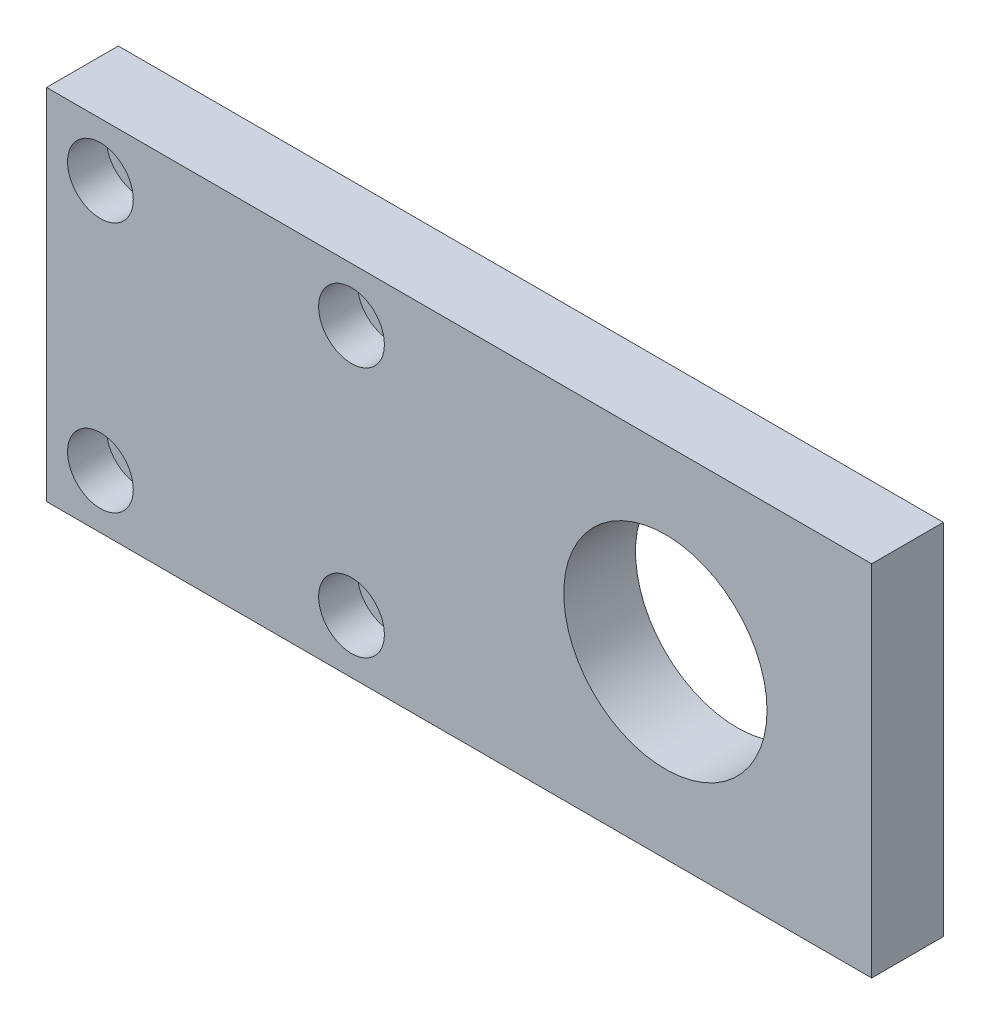
ISO-10303-21;
HEADER;
FILE_DESCRIPTION(('STEP AP214'),'2;1');
FILE_NAME('part.step','',(''),(''),'','','');
FILE_SCHEMA(('AUTOMOTIVE_DESIGN { 1 0 10303 214 1 1 1 1 }'));
ENDSEC;
DATA;
#1=APPLICATION_CONTEXT('core data for automotive mechanical design processes');
#2=APPLICATION_PROTOCOL_DEFINITION('international standard','automotive_design',2000,#1);
#3=PRODUCT_CONTEXT('',#1,'mechanical');
#4=PRODUCT('Part','Part','',(#3));
#5=PRODUCT_RELATED_PRODUCT_CATEGORY('part','',(#4));
#6=PRODUCT_DEFINITION_FORMATION('','',#4);
#7=PRODUCT_DEFINITION_CONTEXT('part definition',#1,'design');
#8=PRODUCT_DEFINITION('design','',#6,#7);
#9=PRODUCT_DEFINITION_SHAPE('','',#8);
#10=(LENGTH_UNIT() NAMED_UNIT(*) SI_UNIT(.MILLI.,.METRE.));
#11=(NAMED_UNIT(*) PLANE_ANGLE_UNIT() SI_UNIT($,.RADIAN.));
#12=(NAMED_UNIT(*) SI_UNIT($,.STERADIAN.) SOLID_ANGLE_UNIT());
#13=UNCERTAINTY_MEASURE_WITH_UNIT(LENGTH_MEASURE(1.E-05),#10,'distance_accuracy_value','');
#14=(GEOMETRIC_REPRESENTATION_CONTEXT(3) GLOBAL_UNCERTAINTY_ASSIGNED_CONTEXT((#13)) GLOBAL_UNIT_ASSIGNED_CONTEXT((#10,
#11,#12)) REPRESENTATION_CONTEXT('',''));
#15=CARTESIAN_POINT('',(0.,0.,0.));
#16=DIRECTION('',(0.,0.,1.));
#17=DIRECTION('',(1.,0.,0.));
#18=AXIS2_PLACEMENT_3D('',#15,#16,#17);
#19=CARTESIAN_POINT('',(0.,0.,12.));
#20=DIRECTION('',(0.,0.,1.));
#21=DIRECTION('',(1.,0.,0.));
#22=AXIS2_PLACEMENT_3D('',#19,#20,#21);
#23=PLANE('',#22);
#24=CARTESIAN_POINT('',(-61.,351.,12.));
#25=DIRECTION('',(0.,0.,1.));
#26=DIRECTION('',(1.,0.,0.));
#27=AXIS2_PLACEMENT_3D('',#24,#25,#26);
#28=CIRCLE('',#27,5.5);
#29=CARTESIAN_POINT('',(-55.5,351.,12.));
#30=VERTEX_POINT('',#29);
#31=EDGE_CURVE('E162',#30,#30,#28,.T.);
#32=ORIENTED_EDGE('',*,*,#31,.F.);
#33=EDGE_LOOP('',(#32));
#34=FACE_BOUND('',#33,.T.);
#35=CARTESIAN_POINT('',(-19.,351.,12.));
#36=DIRECTION('',(0.,0.,1.));
#37=DIRECTION('',(1.,0.,0.));
#38=AXIS2_PLACEMENT_3D('',#35,#36,#37);
#39=CIRCLE('',#38,5.5);
#40=CARTESIAN_POINT('',(-13.5,351.,12.));
#41=VERTEX_POINT('',#40);
#42=EDGE_CURVE('E150',#41,#41,#39,.T.);
#43=ORIENTED_EDGE('',*,*,#42,.F.);
#44=EDGE_LOOP('',(#43));
#45=FACE_BOUND('',#44,.T.);
#46=CARTESIAN_POINT('',(-61.,309.,12.));
#47=DIRECTION('',(0.,0.,1.));
#48=DIRECTION('',(1.,0.,0.));
#49=AXIS2_PLACEMENT_3D('',#46,#47,#48);
#50=CIRCLE('',#49,5.5);
#51=CARTESIAN_POINT('',(-55.5,309.,12.));
#52=VERTEX_POINT('',#51);
#53=EDGE_CURVE('E138',#52,#52,#50,.T.);
#54=ORIENTED_EDGE('',*,*,#53,.F.);
#55=EDGE_LOOP('',(#54));
#56=FACE_BOUND('',#55,.T.);
#57=CARTESIAN_POINT('',(-19.,309.,12.));
#58=DIRECTION('',(0.,0.,1.));
#59=DIRECTION('',(1.,0.,0.));
#60=AXIS2_PLACEMENT_3D('',#57,#58,#59);
#61=CIRCLE('',#60,5.5);
#62=CARTESIAN_POINT('',(-13.5,309.,12.));
#63=VERTEX_POINT('',#62);
#64=EDGE_CURVE('E126',#63,#63,#61,.T.);
#65=ORIENTED_EDGE('',*,*,#64,.F.);
#66=EDGE_LOOP('',(#65));
#67=FACE_BOUND('',#66,.T.);
#68=DIRECTION('',(0.,-1.,0.));
#69=VECTOR('',#68,1.);
#70=CARTESIAN_POINT('',(-70.,360.,12.));
#71=LINE('',#70,#69);
#72=CARTESIAN_POINT('',(-70.,360.,12.));
#73=VERTEX_POINT('',#72);
#74=CARTESIAN_POINT('',(-70.,300.,12.));
#75=VERTEX_POINT('',#74);
#76=EDGE_CURVE('E85',#73,#75,#71,.T.);
#77=ORIENTED_EDGE('',*,*,#76,.T.);
#78=DIRECTION('',(1.,0.,0.));
#79=VECTOR('',#78,1.);
#80=CARTESIAN_POINT('',(-70.,300.,12.));
#81=LINE('',#80,#79);
#82=CARTESIAN_POINT('',(68.,300.,12.));
#83=VERTEX_POINT('',#82);
#84=EDGE_CURVE('E80',#75,#83,#81,.T.);
#85=ORIENTED_EDGE('',*,*,#84,.T.);
#86=DIRECTION('',(0.,1.,0.));
#87=VECTOR('',#86,1.);
#88=CARTESIAN_POINT('',(68.,360.,12.));
#89=LINE('',#88,#87);
#90=CARTESIAN_POINT('',(68.,360.,12.));
#91=VERTEX_POINT('',#90);
#92=EDGE_CURVE('E83',#83,#91,#89,.T.);
#93=ORIENTED_EDGE('',*,*,#92,.T.);
#94=DIRECTION('',(-1.,0.,0.));
#95=VECTOR('',#94,1.);
#96=CARTESIAN_POINT('',(-70.,360.,12.));
#97=LINE('',#96,#95);
#98=EDGE_CURVE('E50',#91,#73,#97,.T.);
#99=ORIENTED_EDGE('',*,*,#98,.T.);
#100=EDGE_LOOP('',(#77,#85,#93,#99));
#101=FACE_BOUND('',#100,.T.);
#102=CARTESIAN_POINT('',(33.5,330.,12.));
#103=DIRECTION('',(0.,0.,1.));
#104=DIRECTION('',(1.,0.,0.));
#105=AXIS2_PLACEMENT_3D('',#102,#103,#104);
#106=CIRCLE('',#105,17.);
#107=CARTESIAN_POINT('',(50.5,330.,12.));
#108=VERTEX_POINT('',#107);
#109=EDGE_CURVE('E100',#108,#108,#106,.T.);
#110=ORIENTED_EDGE('',*,*,#109,.F.);
#111=EDGE_LOOP('',(#110));
#112=FACE_BOUND('',#111,.T.);
#113=ADVANCED_FACE('F33',(#34,#45,#56,#67,#101,#112),#23,.T.);
#114=CARTESIAN_POINT('',(0.,0.,0.));
#115=DIRECTION('',(0.,0.,1.));
#116=DIRECTION('',(1.,0.,0.));
#117=AXIS2_PLACEMENT_3D('',#114,#115,#116);
#118=PLANE('',#117);
#119=CARTESIAN_POINT('',(-61.,351.,0.));
#120=DIRECTION('',(0.,0.,1.));
#121=DIRECTION('',(1.,0.,0.));
#122=AXIS2_PLACEMENT_3D('',#119,#120,#121);
#123=CIRCLE('',#122,2.75);
#124=CARTESIAN_POINT('',(-58.25,351.,0.));
#125=VERTEX_POINT('',#124);
#126=EDGE_CURVE('E153',#125,#125,#123,.T.);
#127=ORIENTED_EDGE('',*,*,#126,.T.);
#128=EDGE_LOOP('',(#127));
#129=FACE_BOUND('',#128,.T.);
#130=CARTESIAN_POINT('',(-19.,351.,0.));
#131=DIRECTION('',(0.,0.,1.));
#132=DIRECTION('',(1.,0.,0.));
#133=AXIS2_PLACEMENT_3D('',#130,#131,#132);
#134=CIRCLE('',#133,2.75);
#135=CARTESIAN_POINT('',(-16.25,351.,0.));
#136=VERTEX_POINT('',#135);
#137=EDGE_CURVE('E141',#136,#136,#134,.T.);
#138=ORIENTED_EDGE('',*,*,#137,.T.);
#139=EDGE_LOOP('',(#138));
#140=FACE_BOUND('',#139,.T.);
#141=CARTESIAN_POINT('',(-61.,309.,0.));
#142=DIRECTION('',(0.,0.,1.));
#143=DIRECTION('',(1.,0.,0.));
#144=AXIS2_PLACEMENT_3D('',#141,#142,#143);
#145=CIRCLE('',#144,2.75);
#146=CARTESIAN_POINT('',(-58.25,309.,0.));
#147=VERTEX_POINT('',#146);
#148=EDGE_CURVE('E129',#147,#147,#145,.T.);
#149=ORIENTED_EDGE('',*,*,#148,.T.);
#150=EDGE_LOOP('',(#149));
#151=FACE_BOUND('',#150,.T.);
#152=CARTESIAN_POINT('',(-19.,309.,0.));
#153=DIRECTION('',(0.,0.,1.));
#154=DIRECTION('',(1.,0.,0.));
#155=AXIS2_PLACEMENT_3D('',#152,#153,#154);
#156=CIRCLE('',#155,2.75);
#157=CARTESIAN_POINT('',(-16.25,309.,0.));
#158=VERTEX_POINT('',#157);
#159=EDGE_CURVE('E115',#158,#158,#156,.T.);
#160=ORIENTED_EDGE('',*,*,#159,.T.);
#161=EDGE_LOOP('',(#160));
#162=FACE_BOUND('',#161,.T.);
#163=DIRECTION('',(0.,-1.,0.));
#164=VECTOR('',#163,1.);
#165=CARTESIAN_POINT('',(-70.,360.,0.));
#166=LINE('',#165,#164);
#167=CARTESIAN_POINT('',(-70.,360.,0.));
#168=VERTEX_POINT('',#167);
#169=CARTESIAN_POINT('',(-70.,300.,0.));
#170=VERTEX_POINT('',#169);
#171=EDGE_CURVE('E97',#168,#170,#166,.T.);
#172=ORIENTED_EDGE('',*,*,#171,.F.);
#173=DIRECTION('',(-1.,0.,0.));
#174=VECTOR('',#173,1.);
#175=CARTESIAN_POINT('',(-70.,360.,0.));
#176=LINE('',#175,#174);
#177=CARTESIAN_POINT('',(68.,360.,0.));
#178=VERTEX_POINT('',#177);
#179=EDGE_CURVE('E73',#178,#168,#176,.T.);
#180=ORIENTED_EDGE('',*,*,#179,.F.);
#181=DIRECTION('',(0.,1.,0.));
#182=VECTOR('',#181,1.);
#183=CARTESIAN_POINT('',(68.,360.,0.));
#184=LINE('',#183,#182);
#185=CARTESIAN_POINT('',(68.,300.,0.));
#186=VERTEX_POINT('',#185);
#187=EDGE_CURVE('E67',#186,#178,#184,.T.);
#188=ORIENTED_EDGE('',*,*,#187,.F.);
#189=DIRECTION('',(1.,0.,0.));
#190=VECTOR('',#189,1.);
#191=CARTESIAN_POINT('',(-70.,300.,0.));
#192=LINE('',#191,#190);
#193=EDGE_CURVE('E89',#170,#186,#192,.T.);
#194=ORIENTED_EDGE('',*,*,#193,.F.);
#195=EDGE_LOOP('',(#172,#180,#188,#194));
#196=FACE_BOUND('',#195,.T.);
#197=CARTESIAN_POINT('',(33.5,330.,0.));
#198=DIRECTION('',(0.,0.,1.));
#199=DIRECTION('',(1.,0.,0.));
#200=AXIS2_PLACEMENT_3D('',#197,#198,#199);
#201=CIRCLE('',#200,17.);
#202=CARTESIAN_POINT('',(50.5,330.,0.));
#203=VERTEX_POINT('',#202);
#204=EDGE_CURVE('E112',#203,#203,#201,.T.);
#205=ORIENTED_EDGE('',*,*,#204,.T.);
#206=EDGE_LOOP('',(#205));
#207=FACE_BOUND('',#206,.T.);
#208=ADVANCED_FACE('F108',(#129,#140,#151,#162,#196,#207),#118,.F.);
#209=CARTESIAN_POINT('',(-70.,360.,12.));
#210=DIRECTION('',(1.,0.,0.));
#211=DIRECTION('',(0.,1.,0.));
#212=AXIS2_PLACEMENT_3D('',#209,#210,#211);
#213=PLANE('',#212);
#214=ORIENTED_EDGE('',*,*,#171,.T.);
#215=DIRECTION('',(0.,0.,-1.));
#216=VECTOR('',#215,1.);
#217=CARTESIAN_POINT('',(-70.,300.,12.));
#218=LINE('',#217,#216);
#219=EDGE_CURVE('E11',#75,#170,#218,.T.);
#220=ORIENTED_EDGE('',*,*,#219,.F.);
#221=ORIENTED_EDGE('',*,*,#76,.F.);
#222=DIRECTION('',(0.,0.,-1.));
#223=VECTOR('',#222,1.);
#224=CARTESIAN_POINT('',(-70.,360.,12.));
#225=LINE('',#224,#223);
#226=EDGE_CURVE('E93',#73,#168,#225,.T.);
#227=ORIENTED_EDGE('',*,*,#226,.T.);
#228=EDGE_LOOP('',(#214,#220,#221,#227));
#229=FACE_BOUND('',#228,.T.);
#230=ADVANCED_FACE('F35',(#229),#213,.F.);
#231=CARTESIAN_POINT('',(-70.,300.,12.));
#232=DIRECTION('',(0.,1.,0.));
#233=DIRECTION('',(0.,0.,1.));
#234=AXIS2_PLACEMENT_3D('',#231,#232,#233);
#235=PLANE('',#234);
#236=ORIENTED_EDGE('',*,*,#193,.T.);
#237=DIRECTION('',(0.,0.,-1.));
#238=VECTOR('',#237,1.);
#239=CARTESIAN_POINT('',(68.,300.,12.));
#240=LINE('',#239,#238);
#241=EDGE_CURVE('E42',#83,#186,#240,.T.);
#242=ORIENTED_EDGE('',*,*,#241,.F.);
#243=ORIENTED_EDGE('',*,*,#84,.F.);
#244=ORIENTED_EDGE('',*,*,#219,.T.);
#245=EDGE_LOOP('',(#236,#242,#243,#244));
#246=FACE_BOUND('',#245,.T.);
#247=ADVANCED_FACE('F88',(#246),#235,.F.);
#248=CARTESIAN_POINT('',(68.,360.,12.));
#249=DIRECTION('',(-1.,0.,0.));
#250=DIRECTION('',(0.,-1.,0.));
#251=AXIS2_PLACEMENT_3D('',#248,#249,#250);
#252=PLANE('',#251);
#253=ORIENTED_EDGE('',*,*,#187,.T.);
#254=DIRECTION('',(0.,0.,-1.));
#255=VECTOR('',#254,1.);
#256=CARTESIAN_POINT('',(68.,360.,12.));
#257=LINE('',#256,#255);
#258=EDGE_CURVE('E90',#91,#178,#257,.T.);
#259=ORIENTED_EDGE('',*,*,#258,.F.);
#260=ORIENTED_EDGE('',*,*,#92,.F.);
#261=ORIENTED_EDGE('',*,*,#241,.T.);
#262=EDGE_LOOP('',(#253,#259,#260,#261));
#263=FACE_BOUND('',#262,.T.);
#264=ADVANCED_FACE('F91',(#263),#252,.F.);
#265=CARTESIAN_POINT('',(-70.,360.,12.));
#266=DIRECTION('',(0.,-1.,0.));
#267=DIRECTION('',(0.,0.,-1.));
#268=AXIS2_PLACEMENT_3D('',#265,#266,#267);
#269=PLANE('',#268);
#270=ORIENTED_EDGE('',*,*,#179,.T.);
#271=ORIENTED_EDGE('',*,*,#226,.F.);
#272=ORIENTED_EDGE('',*,*,#98,.F.);
#273=ORIENTED_EDGE('',*,*,#258,.T.);
#274=EDGE_LOOP('',(#270,#271,#272,#273));
#275=FACE_BOUND('',#274,.T.);
#276=ADVANCED_FACE('F105',(#275),#269,.F.);
#277=CARTESIAN_POINT('',(33.5,330.,12.));
#278=DIRECTION('',(0.,0.,-1.));
#279=DIRECTION('',(-1.,0.,0.));
#280=AXIS2_PLACEMENT_3D('',#277,#278,#279);
#281=CYLINDRICAL_SURFACE('',#280,17.);
#282=ORIENTED_EDGE('',*,*,#109,.T.);
#283=EDGE_LOOP('',(#282));
#284=FACE_BOUND('',#283,.T.);
#285=ORIENTED_EDGE('',*,*,#204,.F.);
#286=EDGE_LOOP('',(#285));
#287=FACE_BOUND('',#286,.T.);
#288=ADVANCED_FACE('F198',(#284,#287),#281,.F.);
#289=CARTESIAN_POINT('',(-19.,309.,12.));
#290=DIRECTION('',(0.,0.,1.));
#291=DIRECTION('',(1.,0.,0.));
#292=AXIS2_PLACEMENT_3D('',#289,#290,#291);
#293=CYLINDRICAL_SURFACE('',#292,2.75);
#294=ORIENTED_EDGE('',*,*,#159,.F.);
#295=EDGE_LOOP('',(#294));
#296=FACE_BOUND('',#295,.T.);
#297=CARTESIAN_POINT('',(-19.,309.,5.5));
#298=DIRECTION('',(0.,0.,1.));
#299=DIRECTION('',(1.,0.,0.));
#300=AXIS2_PLACEMENT_3D('',#297,#298,#299);
#301=CIRCLE('',#300,2.75);
#302=CARTESIAN_POINT('',(-16.25,309.,5.5));
#303=VERTEX_POINT('',#302);
#304=EDGE_CURVE('E120',#303,#303,#301,.T.);
#305=ORIENTED_EDGE('',*,*,#304,.T.);
#306=EDGE_LOOP('',(#305));
#307=FACE_BOUND('',#306,.T.);
#308=ADVANCED_FACE('F190',(#296,#307),#293,.F.);
#309=CARTESIAN_POINT('',(-16.25,309.,5.5));
#310=DIRECTION('',(0.,0.,-1.));
#311=DIRECTION('',(-1.,0.,0.));
#312=AXIS2_PLACEMENT_3D('',#309,#310,#311);
#313=PLANE('',#312);
#314=ORIENTED_EDGE('',*,*,#304,.F.);
#315=EDGE_LOOP('',(#314));
#316=FACE_BOUND('',#315,.T.);
#317=CARTESIAN_POINT('',(-19.,309.,5.5));
#318=DIRECTION('',(0.,0.,1.));
#319=DIRECTION('',(1.,0.,0.));
#320=AXIS2_PLACEMENT_3D('',#317,#318,#319);
#321=CIRCLE('',#320,5.5);
#322=CARTESIAN_POINT('',(-13.5,309.,5.5));
#323=VERTEX_POINT('',#322);
#324=EDGE_CURVE('E123',#323,#323,#321,.T.);
#325=ORIENTED_EDGE('',*,*,#324,.T.);
#326=EDGE_LOOP('',(#325));
#327=FACE_BOUND('',#326,.T.);
#328=ADVANCED_FACE('F180',(#316,#327),#313,.F.);
#329=CARTESIAN_POINT('',(-19.,309.,12.));
#330=DIRECTION('',(0.,0.,1.));
#331=DIRECTION('',(1.,0.,0.));
#332=AXIS2_PLACEMENT_3D('',#329,#330,#331);
#333=CYLINDRICAL_SURFACE('',#332,5.5);
#334=ORIENTED_EDGE('',*,*,#324,.F.);
#335=EDGE_LOOP('',(#334));
#336=FACE_BOUND('',#335,.T.);
#337=ORIENTED_EDGE('',*,*,#64,.T.);
#338=EDGE_LOOP('',(#337));
#339=FACE_BOUND('',#338,.T.);
#340=ADVANCED_FACE('F177',(#336,#339),#333,.F.);
#341=CARTESIAN_POINT('',(-61.,309.,12.));
#342=DIRECTION('',(0.,0.,1.));
#343=DIRECTION('',(1.,0.,0.));
#344=AXIS2_PLACEMENT_3D('',#341,#342,#343);
#345=CYLINDRICAL_SURFACE('',#344,2.75);
#346=ORIENTED_EDGE('',*,*,#148,.F.);
#347=EDGE_LOOP('',(#346));
#348=FACE_BOUND('',#347,.T.);
#349=CARTESIAN_POINT('',(-61.,309.,5.5));
#350=DIRECTION('',(0.,0.,1.));
#351=DIRECTION('',(1.,0.,0.));
#352=AXIS2_PLACEMENT_3D('',#349,#350,#351);
#353=CIRCLE('',#352,2.75);
#354=CARTESIAN_POINT('',(-58.25,309.,5.5));
#355=VERTEX_POINT('',#354);
#356=EDGE_CURVE('E132',#355,#355,#353,.T.);
#357=ORIENTED_EDGE('',*,*,#356,.T.);
#358=EDGE_LOOP('',(#357));
#359=FACE_BOUND('',#358,.T.);
#360=ADVANCED_FACE('F179',(#348,#359),#345,.F.);
#361=CARTESIAN_POINT('',(-58.25,309.,5.5));
#362=DIRECTION('',(0.,0.,-1.));
#363=DIRECTION('',(-1.,0.,0.));
#364=AXIS2_PLACEMENT_3D('',#361,#362,#363);
#365=PLANE('',#364);
#366=ORIENTED_EDGE('',*,*,#356,.F.);
#367=EDGE_LOOP('',(#366));
#368=FACE_BOUND('',#367,.T.);
#369=CARTESIAN_POINT('',(-61.,309.,5.5));
#370=DIRECTION('',(0.,0.,1.));
#371=DIRECTION('',(1.,0.,0.));
#372=AXIS2_PLACEMENT_3D('',#369,#370,#371);
#373=CIRCLE('',#372,5.5);
#374=CARTESIAN_POINT('',(-55.5,309.,5.5));
#375=VERTEX_POINT('',#374);
#376=EDGE_CURVE('E135',#375,#375,#373,.T.);
#377=ORIENTED_EDGE('',*,*,#376,.T.);
#378=EDGE_LOOP('',(#377));
#379=FACE_BOUND('',#378,.T.);
#380=ADVANCED_FACE('F187',(#368,#379),#365,.F.);
#381=CARTESIAN_POINT('',(-61.,309.,12.));
#382=DIRECTION('',(0.,0.,1.));
#383=DIRECTION('',(1.,0.,0.));
#384=AXIS2_PLACEMENT_3D('',#381,#382,#383);
#385=CYLINDRICAL_SURFACE('',#384,5.5);
#386=ORIENTED_EDGE('',*,*,#376,.F.);
#387=EDGE_LOOP('',(#386));
#388=FACE_BOUND('',#387,.T.);
#389=ORIENTED_EDGE('',*,*,#53,.T.);
#390=EDGE_LOOP('',(#389));
#391=FACE_BOUND('',#390,.T.);
#392=ADVANCED_FACE('F278',(#388,#391),#385,.F.);
#393=CARTESIAN_POINT('',(-19.,351.,12.));
#394=DIRECTION('',(0.,0.,1.));
#395=DIRECTION('',(1.,0.,0.));
#396=AXIS2_PLACEMENT_3D('',#393,#394,#395);
#397=CYLINDRICAL_SURFACE('',#396,2.75);
#398=ORIENTED_EDGE('',*,*,#137,.F.);
#399=EDGE_LOOP('',(#398));
#400=FACE_BOUND('',#399,.T.);
#401=CARTESIAN_POINT('',(-19.,351.,5.5));
#402=DIRECTION('',(0.,0.,1.));
#403=DIRECTION('',(1.,0.,0.));
#404=AXIS2_PLACEMENT_3D('',#401,#402,#403);
#405=CIRCLE('',#404,2.75);
#406=CARTESIAN_POINT('',(-16.25,351.,5.5));
#407=VERTEX_POINT('',#406);
#408=EDGE_CURVE('E144',#407,#407,#405,.T.);
#409=ORIENTED_EDGE('',*,*,#408,.T.);
#410=EDGE_LOOP('',(#409));
#411=FACE_BOUND('',#410,.T.);
#412=ADVANCED_FACE('F287',(#400,#411),#397,.F.);
#413=CARTESIAN_POINT('',(-16.25,351.,5.5));
#414=DIRECTION('',(0.,0.,-1.));
#415=DIRECTION('',(-1.,0.,0.));
#416=AXIS2_PLACEMENT_3D('',#413,#414,#415);
#417=PLANE('',#416);
#418=ORIENTED_EDGE('',*,*,#408,.F.);
#419=EDGE_LOOP('',(#418));
#420=FACE_BOUND('',#419,.T.);
#421=CARTESIAN_POINT('',(-19.,351.,5.5));
#422=DIRECTION('',(0.,0.,1.));
#423=DIRECTION('',(1.,0.,0.));
#424=AXIS2_PLACEMENT_3D('',#421,#422,#423);
#425=CIRCLE('',#424,5.5);
#426=CARTESIAN_POINT('',(-13.5,351.,5.5));
#427=VERTEX_POINT('',#426);
#428=EDGE_CURVE('E147',#427,#427,#425,.T.);
#429=ORIENTED_EDGE('',*,*,#428,.T.);
#430=EDGE_LOOP('',(#429));
#431=FACE_BOUND('',#430,.T.);
#432=ADVANCED_FACE('F297',(#420,#431),#417,.F.);
#433=CARTESIAN_POINT('',(-19.,351.,12.));
#434=DIRECTION('',(0.,0.,1.));
#435=DIRECTION('',(1.,0.,0.));
#436=AXIS2_PLACEMENT_3D('',#433,#434,#435);
#437=CYLINDRICAL_SURFACE('',#436,5.5);
#438=ORIENTED_EDGE('',*,*,#428,.F.);
#439=EDGE_LOOP('',(#438));
#440=FACE_BOUND('',#439,.T.);
#441=ORIENTED_EDGE('',*,*,#42,.T.);
#442=EDGE_LOOP('',(#441));
#443=FACE_BOUND('',#442,.T.);
#444=ADVANCED_FACE('F307',(#440,#443),#437,.F.);
#445=CARTESIAN_POINT('',(-61.,351.,12.));
#446=DIRECTION('',(0.,0.,1.));
#447=DIRECTION('',(1.,0.,0.));
#448=AXIS2_PLACEMENT_3D('',#445,#446,#447);
#449=CYLINDRICAL_SURFACE('',#448,2.75);
#450=ORIENTED_EDGE('',*,*,#126,.F.);
#451=EDGE_LOOP('',(#450));
#452=FACE_BOUND('',#451,.T.);
#453=CARTESIAN_POINT('',(-61.,351.,5.5));
#454=DIRECTION('',(0.,0.,1.));
#455=DIRECTION('',(1.,0.,0.));
#456=AXIS2_PLACEMENT_3D('',#453,#454,#455);
#457=CIRCLE('',#456,2.75);
#458=CARTESIAN_POINT('',(-58.25,351.,5.5));
#459=VERTEX_POINT('',#458);
#460=EDGE_CURVE('E156',#459,#459,#457,.T.);
#461=ORIENTED_EDGE('',*,*,#460,.T.);
#462=EDGE_LOOP('',(#461));
#463=FACE_BOUND('',#462,.T.);
#464=ADVANCED_FACE('F317',(#452,#463),#449,.F.);
#465=CARTESIAN_POINT('',(-58.25,351.,5.5));
#466=DIRECTION('',(0.,0.,-1.));
#467=DIRECTION('',(-1.,0.,0.));
#468=AXIS2_PLACEMENT_3D('',#465,#466,#467);
#469=PLANE('',#468);
#470=ORIENTED_EDGE('',*,*,#460,.F.);
#471=EDGE_LOOP('',(#470));
#472=FACE_BOUND('',#471,.T.);
#473=CARTESIAN_POINT('',(-61.,351.,5.5));
#474=DIRECTION('',(0.,0.,1.));
#475=DIRECTION('',(1.,0.,0.));
#476=AXIS2_PLACEMENT_3D('',#473,#474,#475);
#477=CIRCLE('',#476,5.5);
#478=CARTESIAN_POINT('',(-55.5,351.,5.5));
#479=VERTEX_POINT('',#478);
#480=EDGE_CURVE('E159',#479,#479,#477,.T.);
#481=ORIENTED_EDGE('',*,*,#480,.T.);
#482=EDGE_LOOP('',(#481));
#483=FACE_BOUND('',#482,.T.);
#484=ADVANCED_FACE('F327',(#472,#483),#469,.F.);
#485=CARTESIAN_POINT('',(-61.,351.,12.));
#486=DIRECTION('',(0.,0.,1.));
#487=DIRECTION('',(1.,0.,0.));
#488=AXIS2_PLACEMENT_3D('',#485,#486,#487);
#489=CYLINDRICAL_SURFACE('',#488,5.5);
#490=ORIENTED_EDGE('',*,*,#480,.F.);
#491=EDGE_LOOP('',(#490));
#492=FACE_BOUND('',#491,.T.);
#493=ORIENTED_EDGE('',*,*,#31,.T.);
#494=EDGE_LOOP('',(#493));
#495=FACE_BOUND('',#494,.T.);
#496=ADVANCED_FACE('F166',(#492,#495),#489,.F.);
#497=CLOSED_SHELL('',(#113,#208,#230,#247,#264,#276,#288,#308,#328,#340,#360,#380,#392,#412,
#432,#444,#464,#484,#496));
#498=MANIFOLD_SOLID_BREP('B2',#497);
#499=ADVANCED_BREP_SHAPE_REPRESENTATION('',(#18,#498),#14);
#500=SHAPE_DEFINITION_REPRESENTATION(#9,#499);
ENDSEC;
END-ISO-10303-21;
